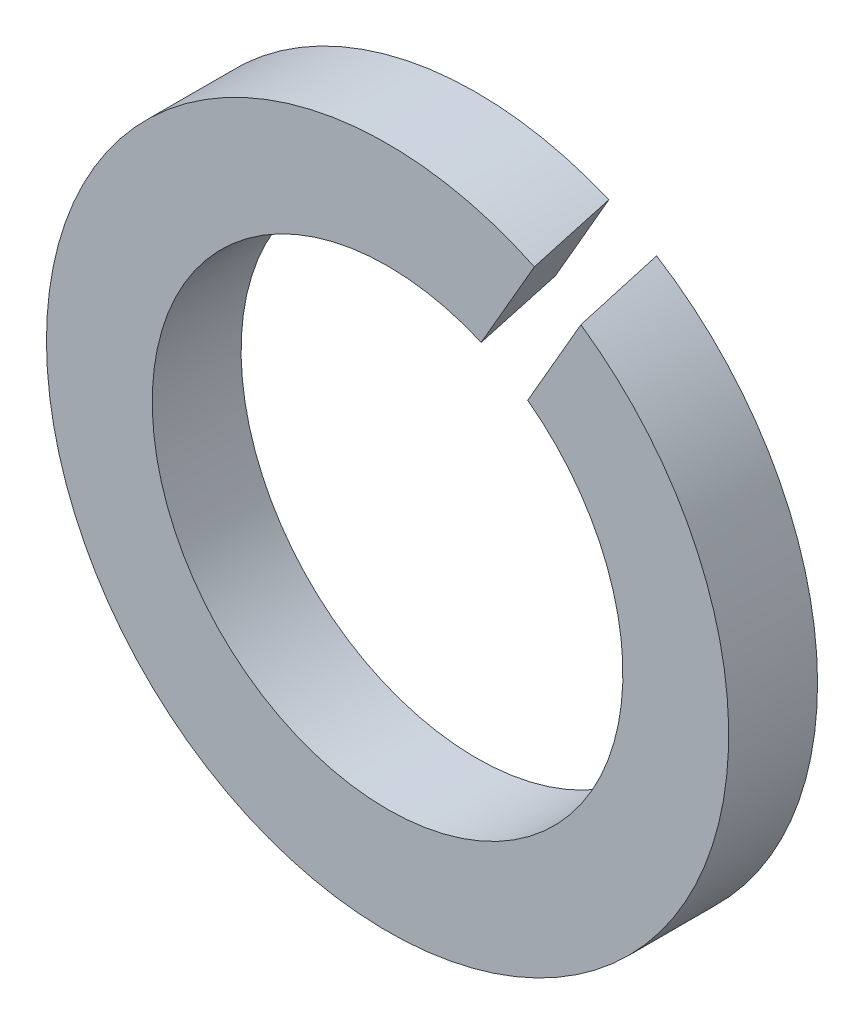
ISO-10303-21;
HEADER;
FILE_DESCRIPTION(('STEP AP214'),'2;1');
FILE_NAME('part.step','',(''),(''),'','','');
FILE_SCHEMA(('AUTOMOTIVE_DESIGN { 1 0 10303 214 1 1 1 1 }'));
ENDSEC;
DATA;
#1=APPLICATION_CONTEXT('core data for automotive mechanical design processes');
#2=APPLICATION_PROTOCOL_DEFINITION('international standard','automotive_design',2000,#1);
#3=PRODUCT_CONTEXT('',#1,'mechanical');
#4=PRODUCT('Part','Part','',(#3));
#5=PRODUCT_RELATED_PRODUCT_CATEGORY('part','',(#4));
#6=PRODUCT_DEFINITION_FORMATION('','',#4);
#7=PRODUCT_DEFINITION_CONTEXT('part definition',#1,'design');
#8=PRODUCT_DEFINITION('design','',#6,#7);
#9=PRODUCT_DEFINITION_SHAPE('','',#8);
#10=(LENGTH_UNIT() NAMED_UNIT(*) SI_UNIT(.MILLI.,.METRE.));
#11=(NAMED_UNIT(*) PLANE_ANGLE_UNIT() SI_UNIT($,.RADIAN.));
#12=(NAMED_UNIT(*) SI_UNIT($,.STERADIAN.) SOLID_ANGLE_UNIT());
#13=UNCERTAINTY_MEASURE_WITH_UNIT(LENGTH_MEASURE(1.E-05),#10,'distance_accuracy_value','');
#14=(GEOMETRIC_REPRESENTATION_CONTEXT(3) GLOBAL_UNCERTAINTY_ASSIGNED_CONTEXT((#13)) GLOBAL_UNIT_ASSIGNED_CONTEXT((#10,
#11,#12)) REPRESENTATION_CONTEXT('',''));
#15=CARTESIAN_POINT('',(0.,0.,0.));
#16=DIRECTION('',(0.,0.,1.));
#17=DIRECTION('',(1.,0.,0.));
#18=AXIS2_PLACEMENT_3D('',#15,#16,#17);
#19=CARTESIAN_POINT('',(-5.5,-10.87627944163,12.));
#20=DIRECTION('',(0.,0.,1.));
#21=DIRECTION('',(1.,0.,0.));
#22=AXIS2_PLACEMENT_3D('',#19,#20,#21);
#23=PLANE('',#22);
#24=CARTESIAN_POINT('',(-5.5,-10.87627944163,12.));
#25=DIRECTION('',(0.,0.,1.));
#26=DIRECTION('',(0.430279172195316,0.902695870143934,0.));
#27=AXIS2_PLACEMENT_3D('',#24,#25,#26);
#28=CIRCLE('',#27,1.6125);
#29=CARTESIAN_POINT('',(-4.806174834835,-9.420682351022,12.));
#30=VERTEX_POINT('',#29);
#31=CARTESIAN_POINT('',(-4.586328524442,-9.547610677507,12.));
#32=VERTEX_POINT('',#31);
#33=EDGE_CURVE('E19',#30,#32,#28,.T.);
#34=ORIENTED_EDGE('',*,*,#33,.T.);
#35=DIRECTION('',(-0.500000000000017,-0.866025403784429,0.));
#36=VECTOR('',#35,1.);
#37=CARTESIAN_POINT('',(-4.586328524442,-9.547610677507,12.));
#38=LINE('',#37,#36);
#39=CARTESIAN_POINT('',(-4.837459108494,-9.98258160842,12.));
#40=VERTEX_POINT('',#39);
#41=EDGE_CURVE('E105',#32,#40,#38,.T.);
#42=ORIENTED_EDGE('',*,*,#41,.T.);
#43=CARTESIAN_POINT('',(-5.5,-10.87627944163,12.));
#44=DIRECTION('',(0.,0.,-1.));
#45=DIRECTION('',(0.595542374387412,0.803323895019315,0.));
#46=AXIS2_PLACEMENT_3D('',#43,#44,#45);
#47=CIRCLE('',#46,1.1125);
#48=CARTESIAN_POINT('',(-5.057305418887,-9.855653281934,12.));
#49=VERTEX_POINT('',#48);
#50=EDGE_CURVE('E77',#40,#49,#47,.T.);
#51=ORIENTED_EDGE('',*,*,#50,.T.);
#52=DIRECTION('',(0.500000000000017,0.866025403784429,0.));
#53=VECTOR('',#52,1.);
#54=CARTESIAN_POINT('',(-5.057305418887,-9.855653281934,12.));
#55=LINE('',#54,#53);
#56=EDGE_CURVE('E11',#49,#30,#55,.T.);
#57=ORIENTED_EDGE('',*,*,#56,.T.);
#58=EDGE_LOOP('',(#34,#42,#51,#57));
#59=FACE_BOUND('',#58,.T.);
#60=ADVANCED_FACE('F16',(#59),#23,.T.);
#61=CARTESIAN_POINT('',(-4.881176866666,-9.948952795293,13.12961474435));
#62=DIRECTION('',(-0.852868531952438,0.492403876506122,0.173648177666908));
#63=DIRECTION('',(0.19951148327884,0.,0.979895488325095));
#64=AXIS2_PLACEMENT_3D('',#61,#62,#63);
#65=PLANE('',#64);
#66=ORIENTED_EDGE('',*,*,#56,.F.);
#67=CARTESIAN_POINT('',(-5.5,-10.87627944163,12.719846310399));
#68=DIRECTION('',(-0.852868531952438,0.492403876506122,0.173648177666908));
#69=DIRECTION('',(-0.150383733180414,0.0868240888334566,-0.984807753012212));
#70=AXIS2_PLACEMENT_3D('',#67,#68,#69);
#71=ELLIPSE('',#70,6.40663216249813,1.1125);
#72=CARTESIAN_POINT('',(-5.126961570463,-9.828186611728,11.58));
#73=VERTEX_POINT('',#72);
#74=EDGE_CURVE('E68',#49,#73,#71,.T.);
#75=ORIENTED_EDGE('',*,*,#74,.T.);
#76=DIRECTION('',(-0.500000000000017,-0.866025403784429,0.));
#77=VECTOR('',#76,1.);
#78=CARTESIAN_POINT('',(-4.874096028215,-9.390210645071,11.58));
#79=LINE('',#78,#77);
#80=CARTESIAN_POINT('',(-4.874096028215,-9.390210645071,11.58));
#81=VERTEX_POINT('',#80);
#82=EDGE_CURVE('E71',#81,#73,#79,.T.);
#83=ORIENTED_EDGE('',*,*,#82,.F.);
#84=CARTESIAN_POINT('',(-5.5,-10.87627944163,12.719846310399));
#85=DIRECTION('',(-0.852868531952438,0.492403876506122,0.173648177666908));
#86=DIRECTION('',(-0.150383733180414,0.0868240888334566,-0.984807753012212));
#87=AXIS2_PLACEMENT_3D('',#84,#85,#86);
#88=ELLIPSE('',#87,9.28601740407032,1.6125);
#89=EDGE_CURVE('E25',#30,#81,#88,.T.);
#90=ORIENTED_EDGE('',*,*,#89,.F.);
#91=EDGE_LOOP('',(#66,#75,#83,#90));
#92=FACE_BOUND('',#91,.T.);
#93=ADVANCED_FACE('F70',(#92),#65,.F.);
#94=CARTESIAN_POINT('',(-5.5,-10.87627944163,12.));
#95=DIRECTION('',(0.,0.,-1.));
#96=DIRECTION('',(0.500000000000017,0.866025403784429,0.));
#97=AXIS2_PLACEMENT_3D('',#94,#95,#96);
#98=CYLINDRICAL_SURFACE('',#97,1.6125);
#99=CARTESIAN_POINT('',(-5.5,-10.87627944163,11.58));
#100=DIRECTION('',(0.,0.,-1.));
#101=DIRECTION('',(0.528126586993512,0.849165654104418,0.));
#102=AXIS2_PLACEMENT_3D('',#99,#100,#101);
#103=CIRCLE('',#102,1.6125);
#104=CARTESIAN_POINT('',(-4.648395878473,-9.506999824385,11.58));
#105=VERTEX_POINT('',#104);
#106=EDGE_CURVE('E85',#105,#81,#103,.T.);
#107=ORIENTED_EDGE('',*,*,#106,.F.);
#108=CARTESIAN_POINT('',(-5.5,-10.87627944163,11.2801536896088));
#109=DIRECTION('',(0.852868531952438,-0.492403876506122,-0.173648177666908));
#110=DIRECTION('',(-0.150383733180414,0.0868240888334566,-0.984807753012212));
#111=AXIS2_PLACEMENT_3D('',#108,#109,#110);
#112=ELLIPSE('',#111,9.28601740407032,1.6125);
#113=EDGE_CURVE('E103',#105,#32,#112,.T.);
#114=ORIENTED_EDGE('',*,*,#113,.T.);
#115=ORIENTED_EDGE('',*,*,#33,.F.);
#116=ORIENTED_EDGE('',*,*,#89,.T.);
#117=EDGE_LOOP('',(#107,#114,#115,#116));
#118=FACE_BOUND('',#117,.T.);
#119=ADVANCED_FACE('F124',(#118),#98,.T.);
#120=CARTESIAN_POINT('',(-4.667959733678,-10.07205376442,13.08620269993));
#121=DIRECTION('',(0.852868531952438,-0.492403876506122,-0.173648177666908));
#122=DIRECTION('',(0.,0.332579245006654,-0.943075312894365));
#123=AXIS2_PLACEMENT_3D('',#120,#121,#122);
#124=PLANE('',#123);
#125=DIRECTION('',(0.500000000000017,0.866025403784429,0.));
#126=VECTOR('',#125,1.);
#127=CARTESIAN_POINT('',(-4.898590897412,-9.940350308989,11.58));
#128=LINE('',#127,#126);
#129=CARTESIAN_POINT('',(-4.898590897412,-9.940350308989,11.58));
#130=VERTEX_POINT('',#129);
#131=EDGE_CURVE('E93',#130,#105,#128,.T.);
#132=ORIENTED_EDGE('',*,*,#131,.F.);
#133=CARTESIAN_POINT('',(-5.5,-10.87627944163,11.2801536896088));
#134=DIRECTION('',(0.852868531952438,-0.492403876506122,-0.173648177666908));
#135=DIRECTION('',(-0.150383733180414,0.0868240888334566,-0.984807753012212));
#136=AXIS2_PLACEMENT_3D('',#133,#134,#135);
#137=ELLIPSE('',#136,6.40663216249813,1.1125);
#138=EDGE_CURVE('E90',#130,#40,#137,.T.);
#139=ORIENTED_EDGE('',*,*,#138,.T.);
#140=ORIENTED_EDGE('',*,*,#41,.F.);
#141=ORIENTED_EDGE('',*,*,#113,.F.);
#142=EDGE_LOOP('',(#132,#139,#140,#141));
#143=FACE_BOUND('',#142,.T.);
#144=ADVANCED_FACE('F118',(#143),#124,.F.);
#145=CARTESIAN_POINT('',(-5.5,-10.87627944163,12.));
#146=DIRECTION('',(0.,0.,-1.));
#147=DIRECTION('',(0.500000000000017,0.866025403784429,0.));
#148=AXIS2_PLACEMENT_3D('',#145,#146,#147);
#149=CYLINDRICAL_SURFACE('',#148,1.1125);
#150=ORIENTED_EDGE('',*,*,#74,.F.);
#151=ORIENTED_EDGE('',*,*,#50,.F.);
#152=ORIENTED_EDGE('',*,*,#138,.F.);
#153=CARTESIAN_POINT('',(-5.5,-10.87627944163,11.58));
#154=DIRECTION('',(0.,0.,1.));
#155=DIRECTION('',(0.335315442280491,0.942105914517173,0.));
#156=AXIS2_PLACEMENT_3D('',#153,#154,#155);
#157=CIRCLE('',#156,1.1125);
#158=EDGE_CURVE('E83',#73,#130,#157,.T.);
#159=ORIENTED_EDGE('',*,*,#158,.F.);
#160=EDGE_LOOP('',(#150,#151,#152,#159));
#161=FACE_BOUND('',#160,.T.);
#162=ADVANCED_FACE('F88',(#161),#149,.F.);
#163=CARTESIAN_POINT('',(-5.5,-10.87627944163,11.58));
#164=DIRECTION('',(0.,0.,-1.));
#165=DIRECTION('',(0.,-1.,0.));
#166=AXIS2_PLACEMENT_3D('',#163,#164,#165);
#167=PLANE('',#166);
#168=ORIENTED_EDGE('',*,*,#158,.T.);
#169=ORIENTED_EDGE('',*,*,#131,.T.);
#170=ORIENTED_EDGE('',*,*,#106,.T.);
#171=ORIENTED_EDGE('',*,*,#82,.T.);
#172=EDGE_LOOP('',(#168,#169,#170,#171));
#173=FACE_BOUND('',#172,.T.);
#174=ADVANCED_FACE('F81',(#173),#167,.T.);
#175=CLOSED_SHELL('',(#60,#93,#119,#144,#162,#174));
#176=MANIFOLD_SOLID_BREP('B1',#175);
#177=ADVANCED_BREP_SHAPE_REPRESENTATION('',(#18,#176),#14);
#178=SHAPE_DEFINITION_REPRESENTATION(#9,#177);
ENDSEC;
END-ISO-10303-21;
